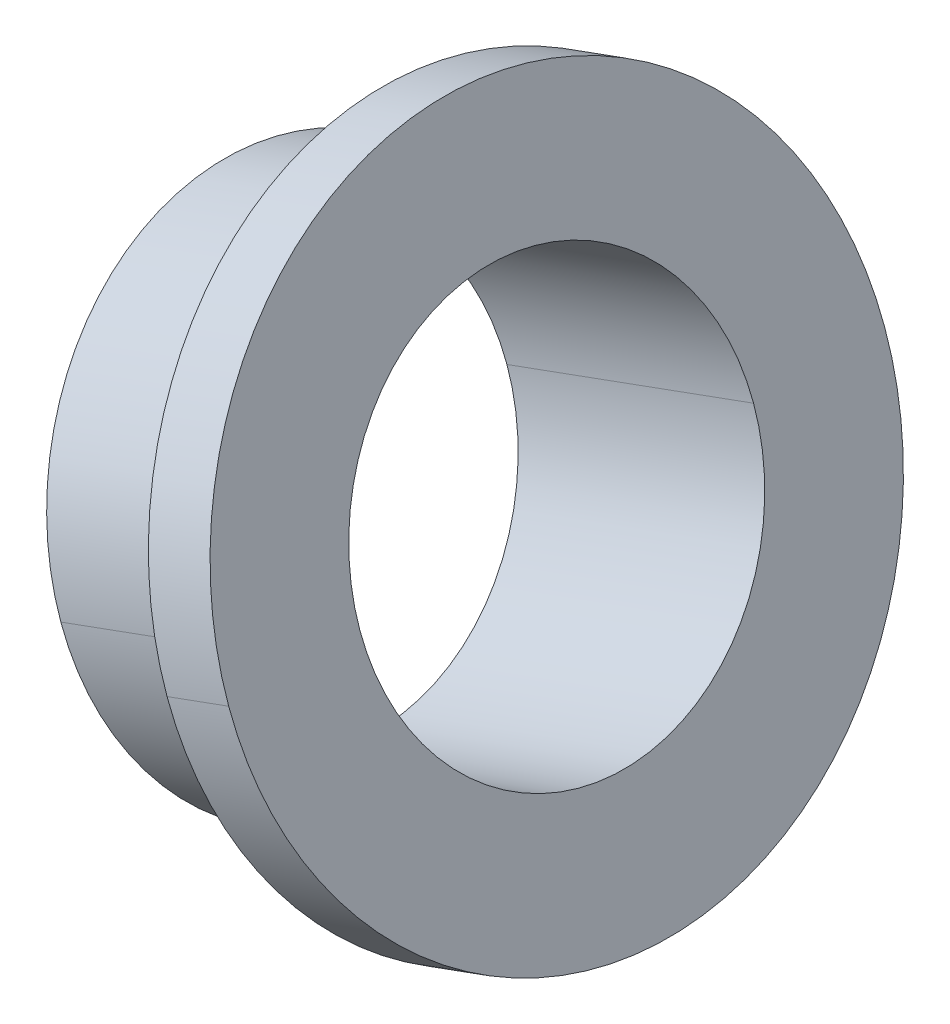
ISO-10303-21;
HEADER;
FILE_DESCRIPTION(('STEP AP214'),'2;1');
FILE_NAME('part.step','',(''),(''),'','','');
FILE_SCHEMA(('AUTOMOTIVE_DESIGN { 1 0 10303 214 1 1 1 1 }'));
ENDSEC;
DATA;
#1=APPLICATION_CONTEXT('core data for automotive mechanical design processes');
#2=APPLICATION_PROTOCOL_DEFINITION('international standard','automotive_design',2000,#1);
#3=PRODUCT_CONTEXT('',#1,'mechanical');
#4=PRODUCT('Part','Part','',(#3));
#5=PRODUCT_RELATED_PRODUCT_CATEGORY('part','',(#4));
#6=PRODUCT_DEFINITION_FORMATION('','',#4);
#7=PRODUCT_DEFINITION_CONTEXT('part definition',#1,'design');
#8=PRODUCT_DEFINITION('design','',#6,#7);
#9=PRODUCT_DEFINITION_SHAPE('','',#8);
#10=(LENGTH_UNIT() NAMED_UNIT(*) SI_UNIT(.MILLI.,.METRE.));
#11=(NAMED_UNIT(*) PLANE_ANGLE_UNIT() SI_UNIT($,.RADIAN.));
#12=(NAMED_UNIT(*) SI_UNIT($,.STERADIAN.) SOLID_ANGLE_UNIT());
#13=UNCERTAINTY_MEASURE_WITH_UNIT(LENGTH_MEASURE(1.E-05),#10,'distance_accuracy_value','');
#14=(GEOMETRIC_REPRESENTATION_CONTEXT(3) GLOBAL_UNCERTAINTY_ASSIGNED_CONTEXT((#13)) GLOBAL_UNIT_ASSIGNED_CONTEXT((#10,
#11,#12)) REPRESENTATION_CONTEXT('',''));
#15=CARTESIAN_POINT('',(0.,0.,0.));
#16=DIRECTION('',(0.,0.,1.));
#17=DIRECTION('',(1.,0.,0.));
#18=AXIS2_PLACEMENT_3D('',#15,#16,#17);
#19=CARTESIAN_POINT('',(1.82611577963621,-22.3876396437817,406.59864258433));
#20=DIRECTION('',(-0.93969262078591,-0.342020143325663,0.));
#21=DIRECTION('',(0.,0.,-1.));
#22=AXIS2_PLACEMENT_3D('',#19,#20,#21);
#23=CYLINDRICAL_SURFACE('',#22,25.);
#24=CARTESIAN_POINT('',(1.82611577963621,-22.3876396437817,406.59864258433));
#25=DIRECTION('',(0.93969262078591,0.342020143325663,0.));
#26=DIRECTION('',(0.,0.,1.));
#27=AXIS2_PLACEMENT_3D('',#24,#25,#26);
#28=CIRCLE('',#27,25.);
#29=CARTESIAN_POINT('',(1.82611577963621,-22.3876396437817,431.59864258433));
#30=VERTEX_POINT('',#29);
#31=CARTESIAN_POINT('',(1.82611577963621,-22.3876396437817,381.59864258433));
#32=VERTEX_POINT('',#31);
#33=EDGE_CURVE('E67',#30,#32,#28,.T.);
#34=ORIENTED_EDGE('',*,*,#33,.F.);
#35=DIRECTION('',(-0.93969262078591,-0.342020143325663,0.));
#36=VECTOR('',#35,1.);
#37=CARTESIAN_POINT('',(1.82611577963621,-22.3876396437817,431.59864258433));
#38=LINE('',#37,#36);
#39=CARTESIAN_POINT('',(-2.87234732429334,-24.0977403604101,431.59864258433));
#40=VERTEX_POINT('',#39);
#41=EDGE_CURVE('E11',#30,#40,#38,.T.);
#42=ORIENTED_EDGE('',*,*,#41,.T.);
#43=CARTESIAN_POINT('',(-2.87234732429334,-24.0977403604101,406.59864258433));
#44=DIRECTION('',(0.93969262078591,0.342020143325663,0.));
#45=DIRECTION('',(0.,0.,1.));
#46=AXIS2_PLACEMENT_3D('',#43,#44,#45);
#47=CIRCLE('',#46,25.);
#48=CARTESIAN_POINT('',(-2.87234732429334,-24.0977403604101,381.59864258433));
#49=VERTEX_POINT('',#48);
#50=EDGE_CURVE('E55',#40,#49,#47,.T.);
#51=ORIENTED_EDGE('',*,*,#50,.T.);
#52=DIRECTION('',(-0.93969262078591,-0.342020143325663,0.));
#53=VECTOR('',#52,1.);
#54=CARTESIAN_POINT('',(1.82611577963621,-22.3876396437817,381.59864258433));
#55=LINE('',#54,#53);
#56=EDGE_CURVE('E102',#32,#49,#55,.T.);
#57=ORIENTED_EDGE('',*,*,#56,.F.);
#58=EDGE_LOOP('',(#34,#42,#51,#57));
#59=FACE_BOUND('',#58,.T.);
#60=ADVANCED_FACE('F44',(#59),#23,.T.);
#61=CARTESIAN_POINT('',(-2.87234732429334,-24.0977403604101,406.59864258433));
#62=DIRECTION('',(-0.93969262078591,-0.342020143325663,0.));
#63=DIRECTION('',(0.,0.,-1.));
#64=AXIS2_PLACEMENT_3D('',#61,#62,#63);
#65=CYLINDRICAL_SURFACE('',#64,15.);
#66=CARTESIAN_POINT('',(1.82611577963621,-22.3876396437817,406.59864258433));
#67=DIRECTION('',(0.93969262078591,0.342020143325663,0.));
#68=DIRECTION('',(0.,0.,1.));
#69=AXIS2_PLACEMENT_3D('',#66,#67,#68);
#70=CIRCLE('',#69,15.);
#71=CARTESIAN_POINT('',(1.82611577963621,-22.3876396437817,391.59864258433));
#72=VERTEX_POINT('',#71);
#73=CARTESIAN_POINT('',(1.82611577963621,-22.3876396437817,421.59864258433));
#74=VERTEX_POINT('',#73);
#75=EDGE_CURVE('E128',#72,#74,#70,.T.);
#76=ORIENTED_EDGE('',*,*,#75,.T.);
#77=DIRECTION('',(-0.93969262078591,-0.342020143325663,0.));
#78=VECTOR('',#77,1.);
#79=CARTESIAN_POINT('',(-2.87234732429334,-24.0977403604101,421.59864258433));
#80=LINE('',#79,#78);
#81=CARTESIAN_POINT('',(-16.967736636082,-29.228042510295,421.59864258433));
#82=VERTEX_POINT('',#81);
#83=EDGE_CURVE('E132',#74,#82,#80,.T.);
#84=ORIENTED_EDGE('',*,*,#83,.T.);
#85=CARTESIAN_POINT('',(-16.967736636082,-29.228042510295,406.59864258433));
#86=DIRECTION('',(0.93969262078591,0.342020143325663,0.));
#87=DIRECTION('',(0.,0.,1.));
#88=AXIS2_PLACEMENT_3D('',#85,#86,#87);
#89=CIRCLE('',#88,15.);
#90=CARTESIAN_POINT('',(-16.967736636082,-29.228042510295,391.59864258433));
#91=VERTEX_POINT('',#90);
#92=EDGE_CURVE('E143',#91,#82,#89,.T.);
#93=ORIENTED_EDGE('',*,*,#92,.F.);
#94=DIRECTION('',(-0.93969262078591,-0.342020143325663,0.));
#95=VECTOR('',#94,1.);
#96=CARTESIAN_POINT('',(-2.87234732429334,-24.0977403604101,391.59864258433));
#97=LINE('',#96,#95);
#98=EDGE_CURVE('E124',#72,#91,#97,.T.);
#99=ORIENTED_EDGE('',*,*,#98,.F.);
#100=EDGE_LOOP('',(#76,#84,#93,#99));
#101=FACE_BOUND('',#100,.T.);
#102=ADVANCED_FACE('F161',(#101),#65,.F.);
#103=CARTESIAN_POINT('',(-2.87234732429334,-24.0977403604101,406.59864258433));
#104=DIRECTION('',(-0.93969262078591,-0.342020143325663,0.));
#105=DIRECTION('',(0.,0.,-1.));
#106=AXIS2_PLACEMENT_3D('',#103,#104,#105);
#107=CYLINDRICAL_SURFACE('',#106,19.);
#108=CARTESIAN_POINT('',(-2.87234732429334,-24.0977403604101,406.59864258433));
#109=DIRECTION('',(0.93969262078591,0.342020143325663,0.));
#110=DIRECTION('',(0.,0.,1.));
#111=AXIS2_PLACEMENT_3D('',#108,#109,#110);
#112=CIRCLE('',#111,19.);
#113=CARTESIAN_POINT('',(-2.87234732429334,-24.0977403604101,425.59864258433));
#114=VERTEX_POINT('',#113);
#115=CARTESIAN_POINT('',(-2.87234732429334,-24.0977403604101,387.59864258433));
#116=VERTEX_POINT('',#115);
#117=EDGE_CURVE('E95',#114,#116,#112,.T.);
#118=ORIENTED_EDGE('',*,*,#117,.F.);
#119=DIRECTION('',(-0.93969262078591,-0.342020143325663,0.));
#120=VECTOR('',#119,1.);
#121=CARTESIAN_POINT('',(-2.87234732429334,-24.0977403604101,425.59864258433));
#122=LINE('',#121,#120);
#123=CARTESIAN_POINT('',(-16.967736636082,-29.228042510295,425.59864258433));
#124=VERTEX_POINT('',#123);
#125=EDGE_CURVE('E111',#114,#124,#122,.T.);
#126=ORIENTED_EDGE('',*,*,#125,.T.);
#127=CARTESIAN_POINT('',(-16.967736636082,-29.228042510295,406.59864258433));
#128=DIRECTION('',(0.93969262078591,0.342020143325663,0.));
#129=DIRECTION('',(0.,0.,1.));
#130=AXIS2_PLACEMENT_3D('',#127,#128,#129);
#131=CIRCLE('',#130,19.);
#132=CARTESIAN_POINT('',(-16.967736636082,-29.228042510295,387.59864258433));
#133=VERTEX_POINT('',#132);
#134=EDGE_CURVE('E104',#124,#133,#131,.T.);
#135=ORIENTED_EDGE('',*,*,#134,.T.);
#136=DIRECTION('',(-0.93969262078591,-0.342020143325663,0.));
#137=VECTOR('',#136,1.);
#138=CARTESIAN_POINT('',(-2.87234732429334,-24.0977403604101,387.59864258433));
#139=LINE('',#138,#137);
#140=EDGE_CURVE('E85',#116,#133,#139,.T.);
#141=ORIENTED_EDGE('',*,*,#140,.F.);
#142=EDGE_LOOP('',(#118,#126,#135,#141));
#143=FACE_BOUND('',#142,.T.);
#144=ADVANCED_FACE('F46',(#143),#107,.T.);
#145=CARTESIAN_POINT('',(-16.967736636082,-29.228042510295,406.59864258433));
#146=DIRECTION('',(0.93969262078591,0.342020143325663,0.));
#147=DIRECTION('',(0.342020143325663,-0.93969262078591,0.));
#148=AXIS2_PLACEMENT_3D('',#145,#146,#147);
#149=PLANE('',#148);
#150=CARTESIAN_POINT('',(-16.967736636082,-29.228042510295,406.59864258433));
#151=DIRECTION('',(0.93969262078591,0.342020143325663,0.));
#152=DIRECTION('',(0.,0.,1.));
#153=AXIS2_PLACEMENT_3D('',#150,#151,#152);
#154=CIRCLE('',#153,19.);
#155=EDGE_CURVE('E108',#133,#124,#154,.T.);
#156=ORIENTED_EDGE('',*,*,#155,.F.);
#157=ORIENTED_EDGE('',*,*,#134,.F.);
#158=EDGE_LOOP('',(#156,#157));
#159=FACE_BOUND('',#158,.T.);
#160=ORIENTED_EDGE('',*,*,#92,.T.);
#161=CARTESIAN_POINT('',(-16.967736636082,-29.228042510295,406.59864258433));
#162=DIRECTION('',(0.93969262078591,0.342020143325663,0.));
#163=DIRECTION('',(0.,0.,1.));
#164=AXIS2_PLACEMENT_3D('',#161,#162,#163);
#165=CIRCLE('',#164,15.);
#166=EDGE_CURVE('E107',#82,#91,#165,.T.);
#167=ORIENTED_EDGE('',*,*,#166,.T.);
#168=EDGE_LOOP('',(#160,#167));
#169=FACE_BOUND('',#168,.T.);
#170=ADVANCED_FACE('F153',(#159,#169),#149,.F.);
#171=CARTESIAN_POINT('',(-2.87234732429334,-24.0977403604101,406.59864258433));
#172=DIRECTION('',(-0.93969262078591,-0.342020143325663,0.));
#173=DIRECTION('',(0.,0.,-1.));
#174=AXIS2_PLACEMENT_3D('',#171,#172,#173);
#175=CYLINDRICAL_SURFACE('',#174,19.);
#176=ORIENTED_EDGE('',*,*,#125,.F.);
#177=CARTESIAN_POINT('',(-2.87234732429334,-24.0977403604101,406.59864258433));
#178=DIRECTION('',(0.93969262078591,0.342020143325663,0.));
#179=DIRECTION('',(0.,0.,1.));
#180=AXIS2_PLACEMENT_3D('',#177,#178,#179);
#181=CIRCLE('',#180,19.);
#182=EDGE_CURVE('E97',#116,#114,#181,.T.);
#183=ORIENTED_EDGE('',*,*,#182,.F.);
#184=ORIENTED_EDGE('',*,*,#140,.T.);
#185=ORIENTED_EDGE('',*,*,#155,.T.);
#186=EDGE_LOOP('',(#176,#183,#184,#185));
#187=FACE_BOUND('',#186,.T.);
#188=ADVANCED_FACE('F110',(#187),#175,.T.);
#189=CARTESIAN_POINT('',(-2.87234732429334,-24.0977403604101,406.59864258433));
#190=DIRECTION('',(-0.93969262078591,-0.342020143325663,0.));
#191=DIRECTION('',(0.,0.,-1.));
#192=AXIS2_PLACEMENT_3D('',#189,#190,#191);
#193=CYLINDRICAL_SURFACE('',#192,15.);
#194=ORIENTED_EDGE('',*,*,#83,.F.);
#195=CARTESIAN_POINT('',(1.82611577963621,-22.3876396437817,406.59864258433));
#196=DIRECTION('',(0.93969262078591,0.342020143325663,0.));
#197=DIRECTION('',(0.,0.,1.));
#198=AXIS2_PLACEMENT_3D('',#195,#196,#197);
#199=CIRCLE('',#198,15.);
#200=EDGE_CURVE('E120',#74,#72,#199,.T.);
#201=ORIENTED_EDGE('',*,*,#200,.T.);
#202=ORIENTED_EDGE('',*,*,#98,.T.);
#203=ORIENTED_EDGE('',*,*,#166,.F.);
#204=EDGE_LOOP('',(#194,#201,#202,#203));
#205=FACE_BOUND('',#204,.T.);
#206=ADVANCED_FACE('F166',(#205),#193,.F.);
#207=CARTESIAN_POINT('',(1.82611577963621,-22.3876396437817,406.59864258433));
#208=DIRECTION('',(0.93969262078591,0.342020143325663,0.));
#209=DIRECTION('',(0.342020143325663,-0.93969262078591,0.));
#210=AXIS2_PLACEMENT_3D('',#207,#208,#209);
#211=PLANE('',#210);
#212=CARTESIAN_POINT('',(1.82611577963621,-22.3876396437817,406.59864258433));
#213=DIRECTION('',(0.93969262078591,0.342020143325663,0.));
#214=DIRECTION('',(0.,0.,1.));
#215=AXIS2_PLACEMENT_3D('',#212,#213,#214);
#216=CIRCLE('',#215,25.);
#217=EDGE_CURVE('E116',#32,#30,#216,.T.);
#218=ORIENTED_EDGE('',*,*,#217,.T.);
#219=ORIENTED_EDGE('',*,*,#33,.T.);
#220=EDGE_LOOP('',(#218,#219));
#221=FACE_BOUND('',#220,.T.);
#222=ORIENTED_EDGE('',*,*,#75,.F.);
#223=ORIENTED_EDGE('',*,*,#200,.F.);
#224=EDGE_LOOP('',(#222,#223));
#225=FACE_BOUND('',#224,.T.);
#226=ADVANCED_FACE('F192',(#221,#225),#211,.T.);
#227=CARTESIAN_POINT('',(-2.87234732429334,-24.0977403604101,406.59864258433));
#228=DIRECTION('',(0.93969262078591,0.342020143325663,0.));
#229=DIRECTION('',(0.342020143325663,-0.93969262078591,0.));
#230=AXIS2_PLACEMENT_3D('',#227,#228,#229);
#231=PLANE('',#230);
#232=CARTESIAN_POINT('',(-2.87234732429334,-24.0977403604101,406.59864258433));
#233=DIRECTION('',(0.93969262078591,0.342020143325663,0.));
#234=DIRECTION('',(0.,0.,1.));
#235=AXIS2_PLACEMENT_3D('',#232,#233,#234);
#236=CIRCLE('',#235,25.);
#237=EDGE_CURVE('E48',#49,#40,#236,.T.);
#238=ORIENTED_EDGE('',*,*,#237,.F.);
#239=ORIENTED_EDGE('',*,*,#50,.F.);
#240=EDGE_LOOP('',(#238,#239));
#241=FACE_BOUND('',#240,.T.);
#242=ORIENTED_EDGE('',*,*,#182,.T.);
#243=ORIENTED_EDGE('',*,*,#117,.T.);
#244=EDGE_LOOP('',(#242,#243));
#245=FACE_BOUND('',#244,.T.);
#246=ADVANCED_FACE('F96',(#241,#245),#231,.F.);
#247=CARTESIAN_POINT('',(1.82611577963621,-22.3876396437817,406.59864258433));
#248=DIRECTION('',(-0.93969262078591,-0.342020143325663,0.));
#249=DIRECTION('',(0.,0.,-1.));
#250=AXIS2_PLACEMENT_3D('',#247,#248,#249);
#251=CYLINDRICAL_SURFACE('',#250,25.);
#252=ORIENTED_EDGE('',*,*,#41,.F.);
#253=ORIENTED_EDGE('',*,*,#217,.F.);
#254=ORIENTED_EDGE('',*,*,#56,.T.);
#255=ORIENTED_EDGE('',*,*,#237,.T.);
#256=EDGE_LOOP('',(#252,#253,#254,#255));
#257=FACE_BOUND('',#256,.T.);
#258=ADVANCED_FACE('F194',(#257),#251,.T.);
#259=CLOSED_SHELL('',(#60,#102,#144,#170,#188,#206,#226,#246,#258));
#260=MANIFOLD_SOLID_BREP('B2',#259);
#261=ADVANCED_BREP_SHAPE_REPRESENTATION('',(#18,#260),#14);
#262=SHAPE_DEFINITION_REPRESENTATION(#9,#261);
ENDSEC;
END-ISO-10303-21;
